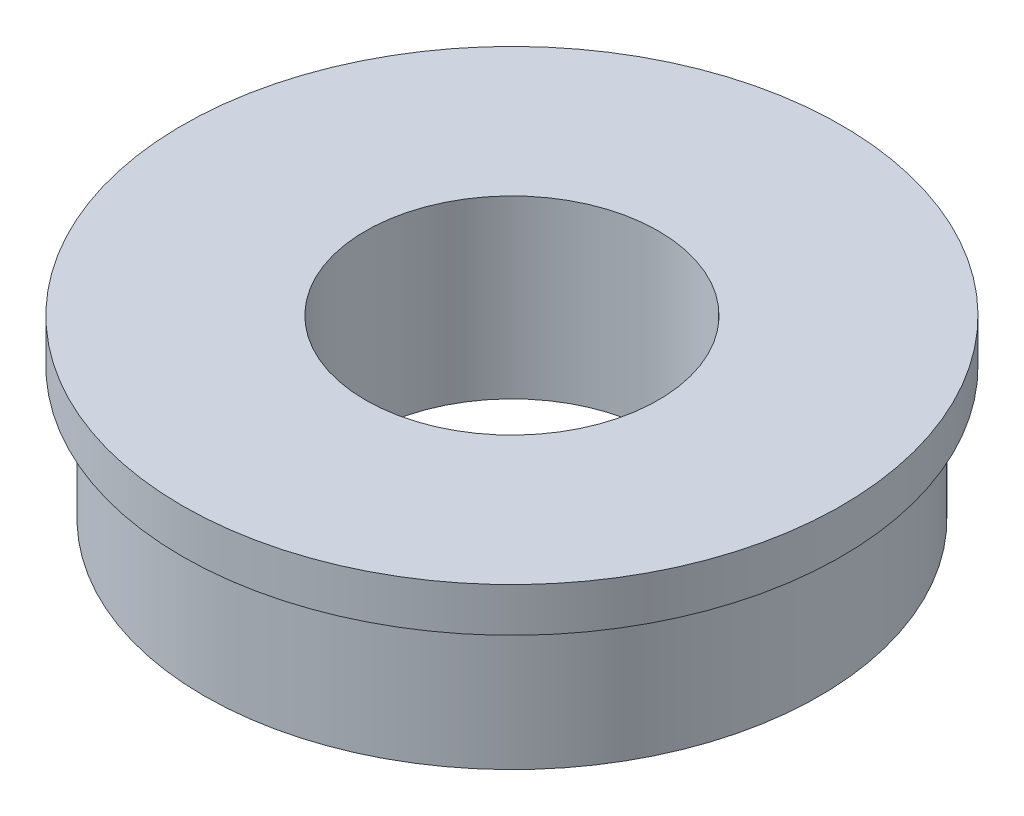
ISO-10303-21;
HEADER;
FILE_DESCRIPTION(('STEP AP214'),'2;1');
FILE_NAME('part.step','',(''),(''),'','','');
FILE_SCHEMA(('AUTOMOTIVE_DESIGN { 1 0 10303 214 1 1 1 1 }'));
ENDSEC;
DATA;
#1=APPLICATION_CONTEXT('core data for automotive mechanical design processes');
#2=APPLICATION_PROTOCOL_DEFINITION('international standard','automotive_design',2000,#1);
#3=PRODUCT_CONTEXT('',#1,'mechanical');
#4=PRODUCT('Part','Part','',(#3));
#5=PRODUCT_RELATED_PRODUCT_CATEGORY('part','',(#4));
#6=PRODUCT_DEFINITION_FORMATION('','',#4);
#7=PRODUCT_DEFINITION_CONTEXT('part definition',#1,'design');
#8=PRODUCT_DEFINITION('design','',#6,#7);
#9=PRODUCT_DEFINITION_SHAPE('','',#8);
#10=(LENGTH_UNIT() NAMED_UNIT(*) SI_UNIT(.MILLI.,.METRE.));
#11=(NAMED_UNIT(*) PLANE_ANGLE_UNIT() SI_UNIT($,.RADIAN.));
#12=(NAMED_UNIT(*) SI_UNIT($,.STERADIAN.) SOLID_ANGLE_UNIT());
#13=UNCERTAINTY_MEASURE_WITH_UNIT(LENGTH_MEASURE(1.E-05),#10,'distance_accuracy_value','');
#14=(GEOMETRIC_REPRESENTATION_CONTEXT(3) GLOBAL_UNCERTAINTY_ASSIGNED_CONTEXT((#13)) GLOBAL_UNIT_ASSIGNED_CONTEXT((#10,
#11,#12)) REPRESENTATION_CONTEXT('',''));
#15=CARTESIAN_POINT('',(0.,0.,0.));
#16=DIRECTION('',(0.,0.,1.));
#17=DIRECTION('',(1.,0.,0.));
#18=AXIS2_PLACEMENT_3D('',#15,#16,#17);
#19=CARTESIAN_POINT('',(0.,0.,0.));
#20=DIRECTION('',(0.,1.,0.));
#21=DIRECTION('',(0.,0.,1.));
#22=AXIS2_PLACEMENT_3D('',#19,#20,#21);
#23=PLANE('',#22);
#24=CARTESIAN_POINT('',(0.,0.,0.));
#25=DIRECTION('',(0.,1.,0.));
#26=DIRECTION('',(0.,0.,1.));
#27=AXIS2_PLACEMENT_3D('',#24,#25,#26);
#28=CIRCLE('',#27,21.);
#29=CARTESIAN_POINT('',(0.,0.,21.));
#30=VERTEX_POINT('',#29);
#31=EDGE_CURVE('E38',#30,#30,#28,.T.);
#32=ORIENTED_EDGE('',*,*,#31,.F.);
#33=EDGE_LOOP('',(#32));
#34=FACE_BOUND('',#33,.T.);
#35=CARTESIAN_POINT('',(0.,0.,0.));
#36=DIRECTION('',(0.,1.,0.));
#37=DIRECTION('',(0.,0.,1.));
#38=AXIS2_PLACEMENT_3D('',#35,#36,#37);
#39=CIRCLE('',#38,10.);
#40=CARTESIAN_POINT('',(0.,0.,10.));
#41=VERTEX_POINT('',#40);
#42=EDGE_CURVE('E45',#41,#41,#39,.T.);
#43=ORIENTED_EDGE('',*,*,#42,.T.);
#44=EDGE_LOOP('',(#43));
#45=FACE_BOUND('',#44,.T.);
#46=ADVANCED_FACE('F34',(#34,#45),#23,.F.);
#47=CARTESIAN_POINT('',(0.,9.,0.));
#48=DIRECTION('',(0.,-1.,0.));
#49=DIRECTION('',(0.,0.,-1.));
#50=AXIS2_PLACEMENT_3D('',#47,#48,#49);
#51=CYLINDRICAL_SURFACE('',#50,21.);
#52=CARTESIAN_POINT('',(0.,9.,0.));
#53=DIRECTION('',(0.,1.,0.));
#54=DIRECTION('',(0.,0.,1.));
#55=AXIS2_PLACEMENT_3D('',#52,#53,#54);
#56=CIRCLE('',#55,21.);
#57=CARTESIAN_POINT('',(0.,9.,21.));
#58=VERTEX_POINT('',#57);
#59=EDGE_CURVE('E10',#58,#58,#56,.T.);
#60=ORIENTED_EDGE('',*,*,#59,.F.);
#61=EDGE_LOOP('',(#60));
#62=FACE_BOUND('',#61,.T.);
#63=ORIENTED_EDGE('',*,*,#31,.T.);
#64=EDGE_LOOP('',(#63));
#65=FACE_BOUND('',#64,.T.);
#66=ADVANCED_FACE('F36',(#62,#65),#51,.T.);
#67=CARTESIAN_POINT('',(0.,9.,0.));
#68=DIRECTION('',(0.,-1.,0.));
#69=DIRECTION('',(0.,0.,-1.));
#70=AXIS2_PLACEMENT_3D('',#67,#68,#69);
#71=CYLINDRICAL_SURFACE('',#70,10.);
#72=ORIENTED_EDGE('',*,*,#42,.F.);
#73=EDGE_LOOP('',(#72));
#74=FACE_BOUND('',#73,.T.);
#75=CARTESIAN_POINT('',(0.,12.,0.));
#76=DIRECTION('',(0.,1.,0.));
#77=DIRECTION('',(0.,0.,1.));
#78=AXIS2_PLACEMENT_3D('',#75,#76,#77);
#79=CIRCLE('',#78,10.);
#80=CARTESIAN_POINT('',(0.,12.,10.));
#81=VERTEX_POINT('',#80);
#82=EDGE_CURVE('E53',#81,#81,#79,.T.);
#83=ORIENTED_EDGE('',*,*,#82,.T.);
#84=EDGE_LOOP('',(#83));
#85=FACE_BOUND('',#84,.T.);
#86=ADVANCED_FACE('F59',(#74,#85),#71,.F.);
#87=CARTESIAN_POINT('',(0.,12.,0.));
#88=DIRECTION('',(0.,1.,0.));
#89=DIRECTION('',(0.,0.,1.));
#90=AXIS2_PLACEMENT_3D('',#87,#88,#89);
#91=PLANE('',#90);
#92=CARTESIAN_POINT('',(0.,12.,0.));
#93=DIRECTION('',(0.,1.,0.));
#94=DIRECTION('',(0.,0.,1.));
#95=AXIS2_PLACEMENT_3D('',#92,#93,#94);
#96=CIRCLE('',#95,22.5);
#97=CARTESIAN_POINT('',(0.,12.,22.5));
#98=VERTEX_POINT('',#97);
#99=EDGE_CURVE('E49',#98,#98,#96,.T.);
#100=ORIENTED_EDGE('',*,*,#99,.T.);
#101=EDGE_LOOP('',(#100));
#102=FACE_BOUND('',#101,.T.);
#103=ORIENTED_EDGE('',*,*,#82,.F.);
#104=EDGE_LOOP('',(#103));
#105=FACE_BOUND('',#104,.T.);
#106=ADVANCED_FACE('F61',(#102,#105),#91,.T.);
#107=CARTESIAN_POINT('',(0.,9.,0.));
#108=DIRECTION('',(0.,1.,0.));
#109=DIRECTION('',(0.,0.,1.));
#110=AXIS2_PLACEMENT_3D('',#107,#108,#109);
#111=PLANE('',#110);
#112=ORIENTED_EDGE('',*,*,#59,.T.);
#113=EDGE_LOOP('',(#112));
#114=FACE_BOUND('',#113,.T.);
#115=CARTESIAN_POINT('',(0.,9.,0.));
#116=DIRECTION('',(0.,1.,0.));
#117=DIRECTION('',(0.,0.,1.));
#118=AXIS2_PLACEMENT_3D('',#115,#116,#117);
#119=CIRCLE('',#118,22.5);
#120=CARTESIAN_POINT('',(0.,9.,22.5));
#121=VERTEX_POINT('',#120);
#122=EDGE_CURVE('E50',#121,#121,#119,.T.);
#123=ORIENTED_EDGE('',*,*,#122,.F.);
#124=EDGE_LOOP('',(#123));
#125=FACE_BOUND('',#124,.T.);
#126=ADVANCED_FACE('F63',(#114,#125),#111,.F.);
#127=CARTESIAN_POINT('',(0.,12.,0.));
#128=DIRECTION('',(0.,-1.,0.));
#129=DIRECTION('',(0.,0.,-1.));
#130=AXIS2_PLACEMENT_3D('',#127,#128,#129);
#131=CYLINDRICAL_SURFACE('',#130,22.5);
#132=ORIENTED_EDGE('',*,*,#99,.F.);
#133=EDGE_LOOP('',(#132));
#134=FACE_BOUND('',#133,.T.);
#135=ORIENTED_EDGE('',*,*,#122,.T.);
#136=EDGE_LOOP('',(#135));
#137=FACE_BOUND('',#136,.T.);
#138=ADVANCED_FACE('F70',(#134,#137),#131,.T.);
#139=CLOSED_SHELL('',(#46,#66,#86,#106,#126,#138));
#140=MANIFOLD_SOLID_BREP('B2',#139);
#141=ADVANCED_BREP_SHAPE_REPRESENTATION('',(#18,#140),#14);
#142=SHAPE_DEFINITION_REPRESENTATION(#9,#141);
ENDSEC;
END-ISO-10303-21;
